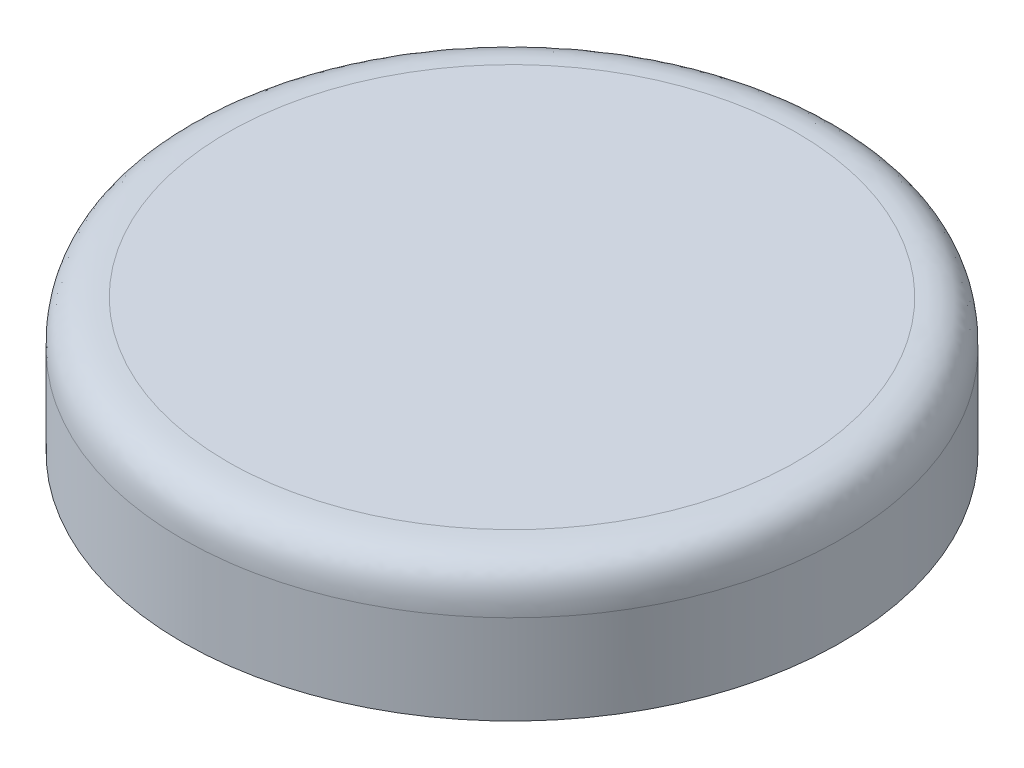
ISO-10303-21;
HEADER;
FILE_DESCRIPTION(('STEP AP214'),'2;1');
FILE_NAME('part.step','',(''),(''),'','','');
FILE_SCHEMA(('AUTOMOTIVE_DESIGN { 1 0 10303 214 1 1 1 1 }'));
ENDSEC;
DATA;
#1=APPLICATION_CONTEXT('core data for automotive mechanical design processes');
#2=APPLICATION_PROTOCOL_DEFINITION('international standard','automotive_design',2000,#1);
#3=PRODUCT_CONTEXT('',#1,'mechanical');
#4=PRODUCT('Part','Part','',(#3));
#5=PRODUCT_RELATED_PRODUCT_CATEGORY('part','',(#4));
#6=PRODUCT_DEFINITION_FORMATION('','',#4);
#7=PRODUCT_DEFINITION_CONTEXT('part definition',#1,'design');
#8=PRODUCT_DEFINITION('design','',#6,#7);
#9=PRODUCT_DEFINITION_SHAPE('','',#8);
#10=(LENGTH_UNIT() NAMED_UNIT(*) SI_UNIT(.MILLI.,.METRE.));
#11=(NAMED_UNIT(*) PLANE_ANGLE_UNIT() SI_UNIT($,.RADIAN.));
#12=(NAMED_UNIT(*) SI_UNIT($,.STERADIAN.) SOLID_ANGLE_UNIT());
#13=UNCERTAINTY_MEASURE_WITH_UNIT(LENGTH_MEASURE(1.E-05),#10,'distance_accuracy_value','');
#14=(GEOMETRIC_REPRESENTATION_CONTEXT(3) GLOBAL_UNCERTAINTY_ASSIGNED_CONTEXT((#13)) GLOBAL_UNIT_ASSIGNED_CONTEXT((#10,
#11,#12)) REPRESENTATION_CONTEXT('',''));
#15=CARTESIAN_POINT('',(0.,0.,0.));
#16=DIRECTION('',(0.,0.,1.));
#17=DIRECTION('',(1.,0.,0.));
#18=AXIS2_PLACEMENT_3D('',#15,#16,#17);
#19=CARTESIAN_POINT('',(0.,14.25,0.));
#20=DIRECTION('',(0.,-1.,0.));
#21=DIRECTION('',(0.,0.,-1.));
#22=AXIS2_PLACEMENT_3D('',#19,#20,#21);
#23=CYLINDRICAL_SURFACE('',#22,35.);
#24=CARTESIAN_POINT('',(0.,9.50000000000001,35.));
#25=CARTESIAN_POINT('',(4.58087276984161,9.50000000000001,35.));
#26=CARTESIAN_POINT('',(13.7426183095248,9.50000000000001,33.1776155053716));
#27=CARTESIAN_POINT('',(25.3930475585697,9.50000000000001,25.3930475585697));
#28=CARTESIAN_POINT('',(33.1776155053716,9.50000000000001,13.7426183095248));
#29=CARTESIAN_POINT('',(35.9111922473142,9.50000000000001,0.));
#30=CARTESIAN_POINT('',(33.1776155053716,9.50000000000001,-13.7426183095248));
#31=CARTESIAN_POINT('',(25.3930475585696,9.50000000000001,-25.3930475585697));
#32=CARTESIAN_POINT('',(13.7426183095249,9.50000000000001,-33.1776155053716));
#33=CARTESIAN_POINT('',(0.,9.50000000000001,-35.9111922473142));
#34=CARTESIAN_POINT('',(-13.7426183095247,9.50000000000001,-33.1776155053716));
#35=CARTESIAN_POINT('',(-25.3930475585697,9.50000000000001,-25.3930475585696));
#36=CARTESIAN_POINT('',(-33.1776155053716,9.50000000000001,-13.7426183095249));
#37=CARTESIAN_POINT('',(-35.9111922473142,9.50000000000001,1.47133821580258E-13));
#38=CARTESIAN_POINT('',(-33.1776155053716,9.50000000000001,13.7426183095247));
#39=CARTESIAN_POINT('',(-25.3930475585698,9.50000000000001,25.3930475585696));
#40=CARTESIAN_POINT('',(-13.7426183095248,9.50000000000001,33.1776155053716));
#41=CARTESIAN_POINT('',(-4.58087276984161,9.50000000000001,35.));
#42=CARTESIAN_POINT('',(0.,9.50000000000001,35.));
#43=B_SPLINE_CURVE_WITH_KNOTS('',3,(#24,#25,#26,#27,#28,#29,#30,#31,#32,#33,#34,#35,#36,#37,#38,
#39,#40,#41,#42),.UNSPECIFIED.,.T.,.F.,(4,1,1,1,1,1,1,1,1,1,1,1,1,1,1,1,4),(0.,
0.392699081698724,0.785398163397448,1.17809724509617,1.5707963267949,1.96349540849362,
2.35619449019234,2.74889357189107,3.14159265358979,3.53429173528852,3.92699081698724,
4.31968989868597,4.71238898038469,5.10508806208341,5.49778714378214,5.89048622548086,
6.28318530717959),.UNSPECIFIED.);
#44=CARTESIAN_POINT('',(0.,9.50000000000001,35.));
#45=VERTEX_POINT('',#44);
#46=EDGE_CURVE('E10',#45,#45,#43,.F.);
#47=ORIENTED_EDGE('',*,*,#46,.T.);
#48=EDGE_LOOP('',(#47));
#49=FACE_BOUND('',#48,.T.);
#50=CARTESIAN_POINT('',(0.,0.,0.));
#51=DIRECTION('',(0.,1.,0.));
#52=DIRECTION('',(0.,0.,1.));
#53=AXIS2_PLACEMENT_3D('',#50,#51,#52);
#54=CIRCLE('',#53,35.);
#55=CARTESIAN_POINT('',(0.,0.,35.));
#56=VERTEX_POINT('',#55);
#57=EDGE_CURVE('E56',#56,#56,#54,.T.);
#58=ORIENTED_EDGE('',*,*,#57,.T.);
#59=EDGE_LOOP('',(#58));
#60=FACE_BOUND('',#59,.T.);
#61=ADVANCED_FACE('F41',(#49,#60),#23,.T.);
#62=CARTESIAN_POINT('',(0.,14.25,0.));
#63=DIRECTION('',(0.,1.,0.));
#64=DIRECTION('',(0.,0.,1.));
#65=AXIS2_PLACEMENT_3D('',#62,#63,#64);
#66=PLANE('',#65);
#67=CARTESIAN_POINT('',(0.,14.25,30.25));
#68=CARTESIAN_POINT('',(-3.95918289393453,14.25,30.25));
#69=CARTESIAN_POINT('',(-11.8775486818036,14.25,28.6749391153569));
#70=CARTESIAN_POINT('',(-21.9468482470496,14.25,21.9468482470494));
#71=CARTESIAN_POINT('',(-28.6749391153569,14.25,11.8775486818035));
#72=CARTESIAN_POINT('',(-31.0375304423216,14.25,1.25492316054716E-13));
#73=CARTESIAN_POINT('',(-28.6749391153568,14.25,-11.8775486818037));
#74=CARTESIAN_POINT('',(-21.9468482470495,14.25,-21.9468482470494));
#75=CARTESIAN_POINT('',(-11.8775486818035,14.25,-28.6749391153569));
#76=CARTESIAN_POINT('',(0.,14.25,-31.0375304423216));
#77=CARTESIAN_POINT('',(11.8775486818037,14.25,-28.6749391153569));
#78=CARTESIAN_POINT('',(21.9468482470494,14.25,-21.9468482470495));
#79=CARTESIAN_POINT('',(28.6749391153569,14.25,-11.8775486818036));
#80=CARTESIAN_POINT('',(31.0375304423216,14.25,0.));
#81=CARTESIAN_POINT('',(28.6749391153569,14.25,11.8775486818036));
#82=CARTESIAN_POINT('',(21.9468482470495,14.25,21.9468482470495));
#83=CARTESIAN_POINT('',(11.8775486818036,14.25,28.6749391153569));
#84=CARTESIAN_POINT('',(3.95918289393453,14.25,30.25));
#85=CARTESIAN_POINT('',(0.,14.25,30.25));
#86=B_SPLINE_CURVE_WITH_KNOTS('',3,(#67,#68,#69,#70,#71,#72,#73,#74,#75,#76,#77,#78,#79,#80,#81,
#82,#83,#84,#85),.UNSPECIFIED.,.T.,.F.,(4,1,1,1,1,1,1,1,1,1,1,1,1,1,1,1,4),(0.,
0.392699081698724,0.785398163397448,1.17809724509617,1.5707963267949,1.96349540849362,
2.35619449019235,2.74889357189107,3.14159265358979,3.53429173528852,3.92699081698724,
4.31968989868597,4.71238898038469,5.10508806208341,5.49778714378214,5.89048622548086,
6.28318530717959),.UNSPECIFIED.);
#87=CARTESIAN_POINT('',(0.,14.25,30.25));
#88=VERTEX_POINT('',#87);
#89=EDGE_CURVE('E53',#88,#88,#86,.F.);
#90=ORIENTED_EDGE('',*,*,#89,.T.);
#91=EDGE_LOOP('',(#90));
#92=FACE_BOUND('',#91,.T.);
#93=ADVANCED_FACE('F80',(#92),#66,.T.);
#94=CARTESIAN_POINT('',(0.,0.,0.));
#95=DIRECTION('',(0.,1.,0.));
#96=DIRECTION('',(0.,0.,1.));
#97=AXIS2_PLACEMENT_3D('',#94,#95,#96);
#98=PLANE('',#97);
#99=CARTESIAN_POINT('',(0.,0.,0.));
#100=DIRECTION('',(0.,-1.,0.));
#101=DIRECTION('',(0.,0.,-1.));
#102=AXIS2_PLACEMENT_3D('',#99,#100,#101);
#103=CIRCLE('',#102,25.95);
#104=CARTESIAN_POINT('',(0.,0.,-25.95));
#105=VERTEX_POINT('',#104);
#106=EDGE_CURVE('E70',#105,#105,#103,.T.);
#107=ORIENTED_EDGE('',*,*,#106,.F.);
#108=EDGE_LOOP('',(#107));
#109=FACE_BOUND('',#108,.T.);
#110=ORIENTED_EDGE('',*,*,#57,.F.);
#111=EDGE_LOOP('',(#110));
#112=FACE_BOUND('',#111,.T.);
#113=ADVANCED_FACE('F87',(#109,#112),#98,.F.);
#114=CARTESIAN_POINT('',(0.,14.25,30.25));
#115=CARTESIAN_POINT('',(3.95918289393453,14.25,30.25));
#116=CARTESIAN_POINT('',(11.8775486818036,14.25,28.6749391153569));
#117=CARTESIAN_POINT('',(21.9468482470495,14.25,21.9468482470495));
#118=CARTESIAN_POINT('',(28.6749391153569,14.25,11.8775486818036));
#119=CARTESIAN_POINT('',(31.0375304423216,14.25,0.));
#120=CARTESIAN_POINT('',(28.6749391153569,14.25,-11.8775486818036));
#121=CARTESIAN_POINT('',(21.9468482470494,14.25,-21.9468482470495));
#122=CARTESIAN_POINT('',(11.8775486818037,14.25,-28.6749391153569));
#123=CARTESIAN_POINT('',(0.,14.25,-31.0375304423216));
#124=CARTESIAN_POINT('',(-11.8775486818035,14.25,-28.6749391153569));
#125=CARTESIAN_POINT('',(-21.9468482470495,14.25,-21.9468482470494));
#126=CARTESIAN_POINT('',(-28.6749391153568,14.25,-11.8775486818037));
#127=CARTESIAN_POINT('',(-31.0375304423216,14.25,1.25492316054716E-13));
#128=CARTESIAN_POINT('',(-28.6749391153569,14.25,11.8775486818035));
#129=CARTESIAN_POINT('',(-21.9468482470496,14.25,21.9468482470494));
#130=CARTESIAN_POINT('',(-11.8775486818036,14.25,28.6749391153569));
#131=CARTESIAN_POINT('',(-3.95918289393453,14.25,30.25));
#132=CARTESIAN_POINT('',(0.,14.25,30.25));
#133=CARTESIAN_POINT('',(0.,14.25,31.0489407447863));
#134=CARTESIAN_POINT('',(4.06374991972048,14.25,31.0489407447863));
#135=CARTESIAN_POINT('',(12.1912497591614,14.25,29.4322805108453));
#136=CARTESIAN_POINT('',(22.5264922564448,14.25,22.5264922564448));
#137=CARTESIAN_POINT('',(29.4322805108453,14.25,12.1912497591614));
#138=CARTESIAN_POINT('',(31.8572708617567,14.25,0.));
#139=CARTESIAN_POINT('',(29.4322805108453,14.25,-12.1912497591614));
#140=CARTESIAN_POINT('',(22.5264922564448,14.25,-22.5264922564448));
#141=CARTESIAN_POINT('',(12.1912497591615,14.25,-29.4322805108452));
#142=CARTESIAN_POINT('',(0.,14.25,-31.8572708617567));
#143=CARTESIAN_POINT('',(-12.1912497591614,14.25,-29.4322805108453));
#144=CARTESIAN_POINT('',(-22.5264922564449,14.25,-22.5264922564447));
#145=CARTESIAN_POINT('',(-29.4322805108452,14.25,-12.1912497591615));
#146=CARTESIAN_POINT('',(-31.8572708617568,14.25,1.28334921099332E-13));
#147=CARTESIAN_POINT('',(-29.4322805108453,14.25,12.1912497591613));
#148=CARTESIAN_POINT('',(-22.5264922564449,14.25,22.5264922564447));
#149=CARTESIAN_POINT('',(-12.1912497591615,14.25,29.4322805108453));
#150=CARTESIAN_POINT('',(-4.06374991972048,14.25,31.0489407447863));
#151=CARTESIAN_POINT('',(0.,14.25,31.0489407447863));
#152=CARTESIAN_POINT('',(0.,14.25,31.8478814895725));
#153=CARTESIAN_POINT('',(4.16831694550643,14.25,31.8478814895725));
#154=CARTESIAN_POINT('',(12.5049508365193,14.25,30.1896219063336));
#155=CARTESIAN_POINT('',(23.1061362658401,14.25,23.1061362658401));
#156=CARTESIAN_POINT('',(30.1896219063337,14.25,12.5049508365193));
#157=CARTESIAN_POINT('',(32.6770112811919,14.25,0.));
#158=CARTESIAN_POINT('',(30.1896219063337,14.25,-12.5049508365193));
#159=CARTESIAN_POINT('',(23.1061362658401,14.25,-23.1061362658401));
#160=CARTESIAN_POINT('',(12.5049508365194,14.25,-30.1896219063336));
#161=CARTESIAN_POINT('',(0.,14.25,-32.6770112811919));
#162=CARTESIAN_POINT('',(-12.5049508365192,14.25,-30.1896219063337));
#163=CARTESIAN_POINT('',(-23.1061362658402,14.25,-23.1061362658401));
#164=CARTESIAN_POINT('',(-30.1896219063336,14.25,-12.5049508365194));
#165=CARTESIAN_POINT('',(-32.6770112811919,14.25,1.29783073212973E-13));
#166=CARTESIAN_POINT('',(-30.1896219063337,14.25,12.5049508365192));
#167=CARTESIAN_POINT('',(-23.1061362658402,14.25,23.1061362658401));
#168=CARTESIAN_POINT('',(-12.5049508365193,14.25,30.1896219063337));
#169=CARTESIAN_POINT('',(-4.16831694550643,14.25,31.8478814895725));
#170=CARTESIAN_POINT('',(0.,14.25,31.8478814895725));
#171=CARTESIAN_POINT('',(0.,13.9094633807786,33.6087572106361));
#172=CARTESIAN_POINT('',(4.39878402098345,13.9094633807786,33.6087572106361));
#173=CARTESIAN_POINT('',(13.1963520629503,13.9094633807786,31.8588121242249));
#174=CARTESIAN_POINT('',(24.3836791495458,13.9094633807786,24.3836791495458));
#175=CARTESIAN_POINT('',(31.8588121242249,13.9094633807786,13.1963520629503));
#176=CARTESIAN_POINT('',(34.4837297538417,13.9094633807786,0.));
#177=CARTESIAN_POINT('',(31.8588121242249,13.9094633807786,-13.1963520629503));
#178=CARTESIAN_POINT('',(24.3836791495457,13.9094633807786,-24.3836791495458));
#179=CARTESIAN_POINT('',(13.1963520629504,13.9094633807786,-31.8588121242248));
#180=CARTESIAN_POINT('',(0.,13.9094633807786,-34.4837297538417));
#181=CARTESIAN_POINT('',(-13.1963520629502,13.9094633807786,-31.8588121242249));
#182=CARTESIAN_POINT('',(-24.3836791495459,13.9094633807786,-24.3836791495457));
#183=CARTESIAN_POINT('',(-31.8588121242248,13.9094633807786,-13.1963520629504));
#184=CARTESIAN_POINT('',(-34.4837297538417,13.9094633807786,1.41811958594726E-13));
#185=CARTESIAN_POINT('',(-31.8588121242249,13.9094633807786,13.1963520629502));
#186=CARTESIAN_POINT('',(-24.3836791495459,13.9094633807786,24.3836791495458));
#187=CARTESIAN_POINT('',(-13.1963520629504,13.9094633807786,31.8588121242249));
#188=CARTESIAN_POINT('',(-4.39878402098345,13.9094633807786,33.6087572106361));
#189=CARTESIAN_POINT('',(0.,13.9094633807786,33.6087572106361));
#190=CARTESIAN_POINT('',(0.,12.8587572106361,34.6594633807786));
#191=CARTESIAN_POINT('',(4.53630262909517,12.8587572106361,34.6594633807786));
#192=CARTESIAN_POINT('',(13.6089078872855,12.8587572106361,32.8548099905709));
#193=CARTESIAN_POINT('',(25.145982913789,12.8587572106361,25.145982913789));
#194=CARTESIAN_POINT('',(32.8548099905708,12.8587572106361,13.6089078872855));
#195=CARTESIAN_POINT('',(35.5617900758825,12.8587572106361,0.));
#196=CARTESIAN_POINT('',(32.8548099905709,12.8587572106361,-13.6089078872855));
#197=CARTESIAN_POINT('',(25.1459829137889,12.8587572106361,-25.145982913789));
#198=CARTESIAN_POINT('',(13.6089078872856,12.8587572106361,-32.8548099905708));
#199=CARTESIAN_POINT('',(0.,12.8587572106361,-35.5617900758825));
#200=CARTESIAN_POINT('',(-13.6089078872854,12.8587572106361,-32.8548099905709));
#201=CARTESIAN_POINT('',(-25.145982913789,12.8587572106361,-25.1459829137889));
#202=CARTESIAN_POINT('',(-32.8548099905708,12.8587572106361,-13.6089078872856));
#203=CARTESIAN_POINT('',(-35.5617900758825,12.8587572106361,1.42017727942195E-13));
#204=CARTESIAN_POINT('',(-32.8548099905709,12.8587572106361,13.6089078872854));
#205=CARTESIAN_POINT('',(-25.1459829137891,12.8587572106361,25.1459829137889));
#206=CARTESIAN_POINT('',(-13.6089078872855,12.8587572106361,32.8548099905708));
#207=CARTESIAN_POINT('',(-4.53630262909517,12.8587572106361,34.6594633807786));
#208=CARTESIAN_POINT('',(0.,12.8587572106361,34.6594633807786));
#209=CARTESIAN_POINT('',(0.,11.0978814895725,35.));
#210=CARTESIAN_POINT('',(4.58087276984161,11.0978814895725,35.));
#211=CARTESIAN_POINT('',(13.7426183095248,11.0978814895725,33.1776155053716));
#212=CARTESIAN_POINT('',(25.3930475585697,11.0978814895725,25.3930475585697));
#213=CARTESIAN_POINT('',(33.1776155053716,11.0978814895725,13.7426183095248));
#214=CARTESIAN_POINT('',(35.9111922473142,11.0978814895725,0.));
#215=CARTESIAN_POINT('',(33.1776155053716,11.0978814895725,-13.7426183095248));
#216=CARTESIAN_POINT('',(25.3930475585696,11.0978814895725,-25.3930475585697));
#217=CARTESIAN_POINT('',(13.7426183095249,11.0978814895725,-33.1776155053716));
#218=CARTESIAN_POINT('',(0.,11.0978814895725,-35.9111922473142));
#219=CARTESIAN_POINT('',(-13.7426183095247,11.0978814895725,-33.1776155053716));
#220=CARTESIAN_POINT('',(-25.3930475585697,11.0978814895725,-25.3930475585696));
#221=CARTESIAN_POINT('',(-33.1776155053716,11.0978814895725,-13.7426183095249));
#222=CARTESIAN_POINT('',(-35.9111922473142,11.0978814895725,1.47133821580258E-13));
#223=CARTESIAN_POINT('',(-33.1776155053716,11.0978814895725,13.7426183095247));
#224=CARTESIAN_POINT('',(-25.3930475585698,11.0978814895725,25.3930475585696));
#225=CARTESIAN_POINT('',(-13.7426183095248,11.0978814895725,33.1776155053716));
#226=CARTESIAN_POINT('',(-4.58087276984161,11.0978814895725,35.));
#227=CARTESIAN_POINT('',(0.,11.0978814895725,35.));
#228=CARTESIAN_POINT('',(0.,10.2989407447862,35.));
#229=CARTESIAN_POINT('',(4.58087276984161,10.2989407447862,35.));
#230=CARTESIAN_POINT('',(13.7426183095248,10.2989407447863,33.1776155053716));
#231=CARTESIAN_POINT('',(25.3930475585697,10.2989407447862,25.3930475585697));
#232=CARTESIAN_POINT('',(33.1776155053716,10.2989407447862,13.7426183095248));
#233=CARTESIAN_POINT('',(35.9111922473142,10.2989407447862,0.));
#234=CARTESIAN_POINT('',(33.1776155053716,10.2989407447863,-13.7426183095248));
#235=CARTESIAN_POINT('',(25.3930475585696,10.2989407447862,-25.3930475585697));
#236=CARTESIAN_POINT('',(13.7426183095249,10.2989407447863,-33.1776155053716));
#237=CARTESIAN_POINT('',(0.,10.2989407447862,-35.9111922473142));
#238=CARTESIAN_POINT('',(-13.7426183095247,10.2989407447863,-33.1776155053716));
#239=CARTESIAN_POINT('',(-25.3930475585697,10.2989407447862,-25.3930475585696));
#240=CARTESIAN_POINT('',(-33.1776155053716,10.2989407447862,-13.7426183095249));
#241=CARTESIAN_POINT('',(-35.9111922473142,10.2989407447862,1.47133821580258E-13));
#242=CARTESIAN_POINT('',(-33.1776155053716,10.2989407447863,13.7426183095247));
#243=CARTESIAN_POINT('',(-25.3930475585698,10.2989407447862,25.3930475585696));
#244=CARTESIAN_POINT('',(-13.7426183095248,10.2989407447863,33.1776155053716));
#245=CARTESIAN_POINT('',(-4.58087276984161,10.2989407447862,35.));
#246=CARTESIAN_POINT('',(0.,10.2989407447862,35.));
#247=CARTESIAN_POINT('',(0.,9.5,35.));
#248=CARTESIAN_POINT('',(4.58087276984161,9.5,35.));
#249=CARTESIAN_POINT('',(13.7426183095248,9.50000000000001,33.1776155053716));
#250=CARTESIAN_POINT('',(25.3930475585697,9.5,25.3930475585697));
#251=CARTESIAN_POINT('',(33.1776155053716,9.5,13.7426183095248));
#252=CARTESIAN_POINT('',(35.9111922473142,9.5,0.));
#253=CARTESIAN_POINT('',(33.1776155053716,9.5,-13.7426183095248));
#254=CARTESIAN_POINT('',(25.3930475585696,9.5,-25.3930475585697));
#255=CARTESIAN_POINT('',(13.7426183095249,9.50000000000001,-33.1776155053716));
#256=CARTESIAN_POINT('',(0.,9.5,-35.9111922473142));
#257=CARTESIAN_POINT('',(-13.7426183095247,9.50000000000001,-33.1776155053716));
#258=CARTESIAN_POINT('',(-25.3930475585697,9.5,-25.3930475585696));
#259=CARTESIAN_POINT('',(-33.1776155053716,9.5,-13.7426183095249));
#260=CARTESIAN_POINT('',(-35.9111922473142,9.5,1.47133821580258E-13));
#261=CARTESIAN_POINT('',(-33.1776155053716,9.5,13.7426183095247));
#262=CARTESIAN_POINT('',(-25.3930475585698,9.50000000000001,25.3930475585696));
#263=CARTESIAN_POINT('',(-13.7426183095248,9.5,33.1776155053716));
#264=CARTESIAN_POINT('',(-4.58087276984161,9.5,35.));
#265=CARTESIAN_POINT('',(0.,9.5,35.));
#266=B_SPLINE_SURFACE_WITH_KNOTS('',5,3,((#114,#115,#116,#117,#118,#119,#120,#121,#122,#123,
#124,#125,#126,#127,#128,#129,#130,#131,#132),(#133,#134,#135,#136,#137,#138,#139,#140,#141,
#142,#143,#144,#145,#146,#147,#148,#149,#150,#151),(#152,#153,#154,#155,#156,#157,#158,#159,
#160,#161,#162,#163,#164,#165,#166,#167,#168,#169,#170),(#171,#172,#173,#174,#175,#176,#177,
#178,#179,#180,#181,#182,#183,#184,#185,#186,#187,#188,#189),(#190,#191,#192,#193,#194,#195,
#196,#197,#198,#199,#200,#201,#202,#203,#204,#205,#206,#207,#208),(#209,#210,#211,#212,#213,
#214,#215,#216,#217,#218,#219,#220,#221,#222,#223,#224,#225,#226,#227),(#228,#229,#230,#231,
#232,#233,#234,#235,#236,#237,#238,#239,#240,#241,#242,#243,#244,#245,#246),(#247,#248,#249,
#250,#251,#252,#253,#254,#255,#256,#257,#258,#259,#260,#261,#262,#263,#264,#265)),.UNSPECIFIED.,
.F.,.T.,.F.,(6,2,6),(4,1,1,1,1,1,1,1,1,1,1,1,1,1,1,1,4),(0.,0.5,1.),(0.,0.392699081698724,
0.785398163397448,1.17809724509617,1.5707963267949,1.96349540849362,2.35619449019234,
2.74889357189107,3.14159265358979,3.53429173528852,3.92699081698724,4.31968989868597,
4.71238898038469,5.10508806208341,5.49778714378214,5.89048622548086,6.28318530717959),.UNSPECIFIED.);
#267=ORIENTED_EDGE('',*,*,#46,.F.);
#268=EDGE_LOOP('',(#267));
#269=FACE_BOUND('',#268,.T.);
#270=ORIENTED_EDGE('',*,*,#89,.F.);
#271=EDGE_LOOP('',(#270));
#272=FACE_BOUND('',#271,.T.);
#273=ADVANCED_FACE('F42',(#269,#272),#266,.T.);
#274=CARTESIAN_POINT('',(0.,8.,0.));
#275=DIRECTION('',(0.,-1.,0.));
#276=DIRECTION('',(0.,0.,-1.));
#277=AXIS2_PLACEMENT_3D('',#274,#275,#276);
#278=CYLINDRICAL_SURFACE('',#277,25.95);
#279=CARTESIAN_POINT('',(0.,8.,0.));
#280=DIRECTION('',(0.,-1.,0.));
#281=DIRECTION('',(0.,0.,-1.));
#282=AXIS2_PLACEMENT_3D('',#279,#280,#281);
#283=CIRCLE('',#282,25.95);
#284=CARTESIAN_POINT('',(0.,8.,-25.95));
#285=VERTEX_POINT('',#284);
#286=EDGE_CURVE('E62',#285,#285,#283,.T.);
#287=ORIENTED_EDGE('',*,*,#286,.F.);
#288=EDGE_LOOP('',(#287));
#289=FACE_BOUND('',#288,.T.);
#290=ORIENTED_EDGE('',*,*,#106,.T.);
#291=EDGE_LOOP('',(#290));
#292=FACE_BOUND('',#291,.T.);
#293=ADVANCED_FACE('F86',(#289,#292),#278,.F.);
#294=CARTESIAN_POINT('',(0.,8.,0.));
#295=DIRECTION('',(0.,-1.,0.));
#296=DIRECTION('',(0.,0.,-1.));
#297=AXIS2_PLACEMENT_3D('',#294,#295,#296);
#298=PLANE('',#297);
#299=CARTESIAN_POINT('',(0.,8.,0.));
#300=DIRECTION('',(0.,-1.,0.));
#301=DIRECTION('',(0.,0.,-1.));
#302=AXIS2_PLACEMENT_3D('',#299,#300,#301);
#303=CIRCLE('',#302,23.);
#304=CARTESIAN_POINT('',(0.,8.,-23.));
#305=VERTEX_POINT('',#304);
#306=EDGE_CURVE('E129',#305,#305,#303,.T.);
#307=ORIENTED_EDGE('',*,*,#306,.F.);
#308=EDGE_LOOP('',(#307));
#309=FACE_BOUND('',#308,.T.);
#310=ORIENTED_EDGE('',*,*,#286,.T.);
#311=EDGE_LOOP('',(#310));
#312=FACE_BOUND('',#311,.T.);
#313=ADVANCED_FACE('F118',(#309,#312),#298,.T.);
#314=CARTESIAN_POINT('',(0.,10.75,0.));
#315=DIRECTION('',(0.,-1.,0.));
#316=DIRECTION('',(0.,0.,-1.));
#317=AXIS2_PLACEMENT_3D('',#314,#315,#316);
#318=CYLINDRICAL_SURFACE('',#317,23.);
#319=CARTESIAN_POINT('',(0.,10.75,0.));
#320=DIRECTION('',(0.,-1.,0.));
#321=DIRECTION('',(0.,0.,-1.));
#322=AXIS2_PLACEMENT_3D('',#319,#320,#321);
#323=CIRCLE('',#322,23.);
#324=CARTESIAN_POINT('',(0.,10.75,-23.));
#325=VERTEX_POINT('',#324);
#326=EDGE_CURVE('E130',#325,#325,#323,.T.);
#327=ORIENTED_EDGE('',*,*,#326,.F.);
#328=EDGE_LOOP('',(#327));
#329=FACE_BOUND('',#328,.T.);
#330=ORIENTED_EDGE('',*,*,#306,.T.);
#331=EDGE_LOOP('',(#330));
#332=FACE_BOUND('',#331,.T.);
#333=ADVANCED_FACE('F123',(#329,#332),#318,.F.);
#334=CARTESIAN_POINT('',(0.,10.75,0.));
#335=DIRECTION('',(0.,-1.,0.));
#336=DIRECTION('',(0.,0.,-1.));
#337=AXIS2_PLACEMENT_3D('',#334,#335,#336);
#338=PLANE('',#337);
#339=CARTESIAN_POINT('',(0.,10.75,0.));
#340=DIRECTION('',(0.,-1.,0.));
#341=DIRECTION('',(0.,0.,-1.));
#342=AXIS2_PLACEMENT_3D('',#339,#340,#341);
#343=CIRCLE('',#342,3.);
#344=CARTESIAN_POINT('',(0.,10.75,-3.));
#345=VERTEX_POINT('',#344);
#346=EDGE_CURVE('E139',#345,#345,#343,.T.);
#347=ORIENTED_EDGE('',*,*,#346,.F.);
#348=EDGE_LOOP('',(#347));
#349=FACE_BOUND('',#348,.T.);
#350=ORIENTED_EDGE('',*,*,#326,.T.);
#351=EDGE_LOOP('',(#350));
#352=FACE_BOUND('',#351,.T.);
#353=ADVANCED_FACE('F146',(#349,#352),#338,.T.);
#354=CARTESIAN_POINT('',(0.,12.,0.));
#355=DIRECTION('',(0.,-1.,0.));
#356=DIRECTION('',(0.,0.,-1.));
#357=AXIS2_PLACEMENT_3D('',#354,#355,#356);
#358=CYLINDRICAL_SURFACE('',#357,3.);
#359=CARTESIAN_POINT('',(0.,12.,0.));
#360=DIRECTION('',(0.,-1.,0.));
#361=DIRECTION('',(0.,0.,-1.));
#362=AXIS2_PLACEMENT_3D('',#359,#360,#361);
#363=CIRCLE('',#362,3.);
#364=CARTESIAN_POINT('',(0.,12.,-3.));
#365=VERTEX_POINT('',#364);
#366=EDGE_CURVE('E132',#365,#365,#363,.T.);
#367=ORIENTED_EDGE('',*,*,#366,.F.);
#368=EDGE_LOOP('',(#367));
#369=FACE_BOUND('',#368,.T.);
#370=ORIENTED_EDGE('',*,*,#346,.T.);
#371=EDGE_LOOP('',(#370));
#372=FACE_BOUND('',#371,.T.);
#373=ADVANCED_FACE('F144',(#369,#372),#358,.F.);
#374=CARTESIAN_POINT('',(0.,12.,0.));
#375=DIRECTION('',(0.,-1.,0.));
#376=DIRECTION('',(0.,0.,-1.));
#377=AXIS2_PLACEMENT_3D('',#374,#375,#376);
#378=PLANE('',#377);
#379=ORIENTED_EDGE('',*,*,#366,.T.);
#380=EDGE_LOOP('',(#379));
#381=FACE_BOUND('',#380,.T.);
#382=ADVANCED_FACE('F141',(#381),#378,.T.);
#383=CLOSED_SHELL('',(#61,#93,#113,#273,#293,#313,#333,#353,#373,#382));
#384=MANIFOLD_SOLID_BREP('B2',#383);
#385=ADVANCED_BREP_SHAPE_REPRESENTATION('',(#18,#384),#14);
#386=SHAPE_DEFINITION_REPRESENTATION(#9,#385);
ENDSEC;
END-ISO-10303-21;
